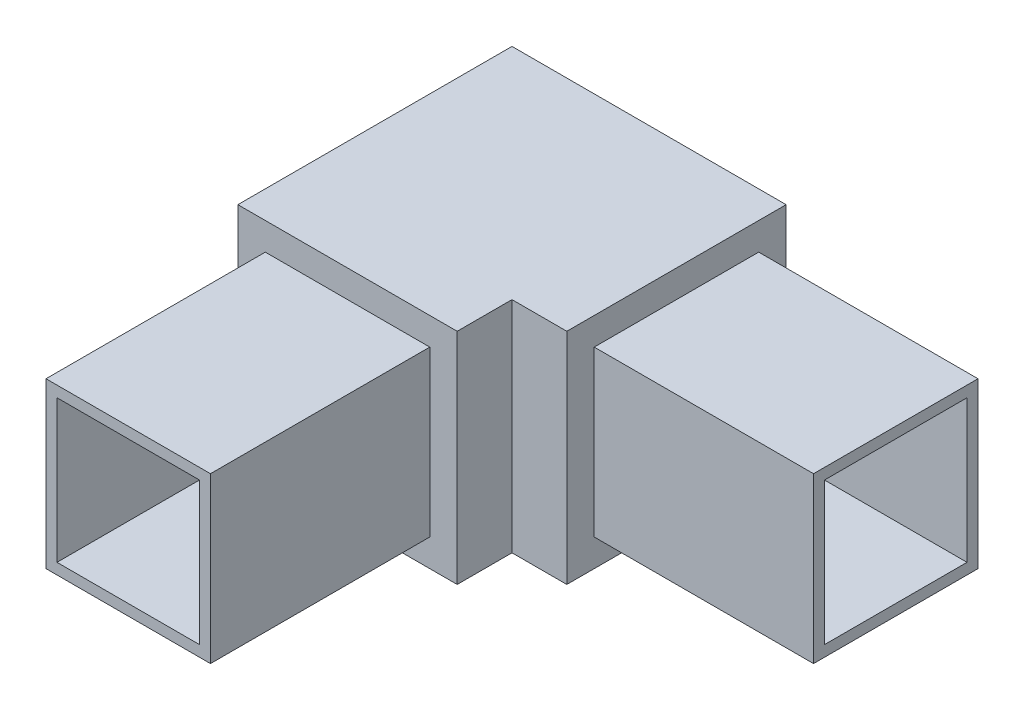
ISO-10303-21;
HEADER;
FILE_DESCRIPTION(('STEP AP214'),'2;1');
FILE_NAME('part.step','',(''),(''),'','','');
FILE_SCHEMA(('AUTOMOTIVE_DESIGN { 1 0 10303 214 1 1 1 1 }'));
ENDSEC;
DATA;
#1=APPLICATION_CONTEXT('core data for automotive mechanical design processes');
#2=APPLICATION_PROTOCOL_DEFINITION('international standard','automotive_design',2000,#1);
#3=PRODUCT_CONTEXT('',#1,'mechanical');
#4=PRODUCT('Part','Part','',(#3));
#5=PRODUCT_RELATED_PRODUCT_CATEGORY('part','',(#4));
#6=PRODUCT_DEFINITION_FORMATION('','',#4);
#7=PRODUCT_DEFINITION_CONTEXT('part definition',#1,'design');
#8=PRODUCT_DEFINITION('design','',#6,#7);
#9=PRODUCT_DEFINITION_SHAPE('','',#8);
#10=(LENGTH_UNIT() NAMED_UNIT(*) SI_UNIT(.MILLI.,.METRE.));
#11=(NAMED_UNIT(*) PLANE_ANGLE_UNIT() SI_UNIT($,.RADIAN.));
#12=(NAMED_UNIT(*) SI_UNIT($,.STERADIAN.) SOLID_ANGLE_UNIT());
#13=UNCERTAINTY_MEASURE_WITH_UNIT(LENGTH_MEASURE(1.E-05),#10,'distance_accuracy_value','');
#14=(GEOMETRIC_REPRESENTATION_CONTEXT(3) GLOBAL_UNCERTAINTY_ASSIGNED_CONTEXT((#13)) GLOBAL_UNIT_ASSIGNED_CONTEXT((#10,
#11,#12)) REPRESENTATION_CONTEXT('',''));
#15=CARTESIAN_POINT('',(0.,0.,0.));
#16=DIRECTION('',(0.,0.,1.));
#17=DIRECTION('',(1.,0.,0.));
#18=AXIS2_PLACEMENT_3D('',#15,#16,#17);
#19=CARTESIAN_POINT('',(70.,40.,-1082.0432663456));
#20=DIRECTION('',(-1.,0.,0.));
#21=DIRECTION('',(0.,0.,-1.));
#22=AXIS2_PLACEMENT_3D('',#19,#20,#21);
#23=PLANE('',#22);
#24=DIRECTION('',(0.,-1.,0.));
#25=VECTOR('',#24,1.);
#26=CARTESIAN_POINT('',(70.,35.,-1115.));
#27=LINE('',#26,#25);
#28=CARTESIAN_POINT('',(70.,35.,-1115.));
#29=VERTEX_POINT('',#28);
#30=CARTESIAN_POINT('',(70.,5.,-1115.));
#31=VERTEX_POINT('',#30);
#32=EDGE_CURVE('E380',#29,#31,#27,.T.);
#33=ORIENTED_EDGE('',*,*,#32,.F.);
#34=DIRECTION('',(0.,0.,-1.));
#35=VECTOR('',#34,1.);
#36=CARTESIAN_POINT('',(70.,35.,-1085.));
#37=LINE('',#36,#35);
#38=CARTESIAN_POINT('',(70.,35.,-1085.));
#39=VERTEX_POINT('',#38);
#40=EDGE_CURVE('E385',#39,#29,#37,.T.);
#41=ORIENTED_EDGE('',*,*,#40,.F.);
#42=DIRECTION('',(0.,1.,0.));
#43=VECTOR('',#42,1.);
#44=CARTESIAN_POINT('',(70.,5.,-1085.));
#45=LINE('',#44,#43);
#46=CARTESIAN_POINT('',(70.,5.,-1085.));
#47=VERTEX_POINT('',#46);
#48=EDGE_CURVE('E400',#47,#39,#45,.T.);
#49=ORIENTED_EDGE('',*,*,#48,.F.);
#50=DIRECTION('',(0.,0.,1.));
#51=VECTOR('',#50,1.);
#52=CARTESIAN_POINT('',(70.,5.,-1115.));
#53=LINE('',#52,#51);
#54=EDGE_CURVE('E397',#31,#47,#53,.T.);
#55=ORIENTED_EDGE('',*,*,#54,.F.);
#56=EDGE_LOOP('',(#33,#41,#49,#55));
#57=FACE_BOUND('',#56,.T.);
#58=DIRECTION('',(0.,-1.,0.));
#59=VECTOR('',#58,1.);
#60=CARTESIAN_POINT('',(70.,35.,-1113.));
#61=LINE('',#60,#59);
#62=CARTESIAN_POINT('',(70.,33.,-1113.));
#63=VERTEX_POINT('',#62);
#64=CARTESIAN_POINT('',(70.,7.,-1113.));
#65=VERTEX_POINT('',#64);
#66=EDGE_CURVE('E238',#63,#65,#61,.T.);
#67=ORIENTED_EDGE('',*,*,#66,.T.);
#68=DIRECTION('',(0.,0.,1.));
#69=VECTOR('',#68,1.);
#70=CARTESIAN_POINT('',(70.,7.,-1115.));
#71=LINE('',#70,#69);
#72=CARTESIAN_POINT('',(70.,7.,-1087.));
#73=VERTEX_POINT('',#72);
#74=EDGE_CURVE('E319',#65,#73,#71,.T.);
#75=ORIENTED_EDGE('',*,*,#74,.T.);
#76=DIRECTION('',(0.,1.,0.));
#77=VECTOR('',#76,1.);
#78=CARTESIAN_POINT('',(70.,5.,-1087.));
#79=LINE('',#78,#77);
#80=CARTESIAN_POINT('',(70.,33.,-1087.));
#81=VERTEX_POINT('',#80);
#82=EDGE_CURVE('E322',#73,#81,#79,.T.);
#83=ORIENTED_EDGE('',*,*,#82,.T.);
#84=DIRECTION('',(0.,0.,-1.));
#85=VECTOR('',#84,1.);
#86=CARTESIAN_POINT('',(70.,33.,-1085.));
#87=LINE('',#86,#85);
#88=EDGE_CURVE('E291',#81,#63,#87,.T.);
#89=ORIENTED_EDGE('',*,*,#88,.T.);
#90=EDGE_LOOP('',(#67,#75,#83,#89));
#91=FACE_BOUND('',#90,.T.);
#92=ADVANCED_FACE('F32',(#57,#91),#23,.F.);
#93=CARTESIAN_POINT('',(-103.501393306404,40.,-1082.0432663456));
#94=DIRECTION('',(0.,1.,0.));
#95=DIRECTION('',(0.,0.,-1.));
#96=AXIS2_PLACEMENT_3D('',#93,#94,#95);
#97=PLANE('',#96);
#98=DIRECTION('',(0.,0.,1.));
#99=VECTOR('',#98,1.);
#100=CARTESIAN_POINT('',(20.,40.,-1082.0432663456));
#101=LINE('',#100,#99);
#102=CARTESIAN_POINT('',(20.,40.,-1080.));
#103=VERTEX_POINT('',#102);
#104=CARTESIAN_POINT('',(20.,40.,-1070.));
#105=VERTEX_POINT('',#104);
#106=EDGE_CURVE('E433',#103,#105,#101,.T.);
#107=ORIENTED_EDGE('',*,*,#106,.F.);
#108=DIRECTION('',(1.,0.,0.));
#109=VECTOR('',#108,1.);
#110=CARTESIAN_POINT('',(-103.501393306404,40.,-1080.));
#111=LINE('',#110,#109);
#112=CARTESIAN_POINT('',(30.,40.,-1080.));
#113=VERTEX_POINT('',#112);
#114=EDGE_CURVE('E430',#103,#113,#111,.T.);
#115=ORIENTED_EDGE('',*,*,#114,.T.);
#116=DIRECTION('',(0.,0.,-1.));
#117=VECTOR('',#116,1.);
#118=CARTESIAN_POINT('',(30.,40.,-1080.));
#119=LINE('',#118,#117);
#120=CARTESIAN_POINT('',(30.,40.,-1120.));
#121=VERTEX_POINT('',#120);
#122=EDGE_CURVE('E419',#113,#121,#119,.T.);
#123=ORIENTED_EDGE('',*,*,#122,.T.);
#124=DIRECTION('',(-1.,0.,0.));
#125=VECTOR('',#124,1.);
#126=CARTESIAN_POINT('',(-103.501393306404,40.,-1120.));
#127=LINE('',#126,#125);
#128=CARTESIAN_POINT('',(-20.,40.,-1120.));
#129=VERTEX_POINT('',#128);
#130=EDGE_CURVE('E426',#121,#129,#127,.T.);
#131=ORIENTED_EDGE('',*,*,#130,.T.);
#132=DIRECTION('',(0.,0.,1.));
#133=VECTOR('',#132,1.);
#134=CARTESIAN_POINT('',(-20.,40.,-1082.0432663456));
#135=LINE('',#134,#133);
#136=CARTESIAN_POINT('',(-20.,40.,-1070.));
#137=VERTEX_POINT('',#136);
#138=EDGE_CURVE('E423',#129,#137,#135,.T.);
#139=ORIENTED_EDGE('',*,*,#138,.T.);
#140=DIRECTION('',(1.,0.,0.));
#141=VECTOR('',#140,1.);
#142=CARTESIAN_POINT('',(-20.,40.,-1070.));
#143=LINE('',#142,#141);
#144=EDGE_CURVE('E377',#137,#105,#143,.T.);
#145=ORIENTED_EDGE('',*,*,#144,.T.);
#146=EDGE_LOOP('',(#107,#115,#123,#131,#139,#145));
#147=FACE_BOUND('',#146,.T.);
#148=ADVANCED_FACE('F464',(#147),#97,.T.);
#149=CARTESIAN_POINT('',(-103.501393306404,0.,-1082.0432663456));
#150=DIRECTION('',(0.,1.,0.));
#151=DIRECTION('',(0.,0.,-1.));
#152=AXIS2_PLACEMENT_3D('',#149,#150,#151);
#153=PLANE('',#152);
#154=DIRECTION('',(-1.,0.,0.));
#155=VECTOR('',#154,1.);
#156=CARTESIAN_POINT('',(20.,0.,-1070.));
#157=LINE('',#156,#155);
#158=CARTESIAN_POINT('',(20.,0.,-1070.));
#159=VERTEX_POINT('',#158);
#160=CARTESIAN_POINT('',(-20.,0.,-1070.));
#161=VERTEX_POINT('',#160);
#162=EDGE_CURVE('E372',#159,#161,#157,.T.);
#163=ORIENTED_EDGE('',*,*,#162,.T.);
#164=DIRECTION('',(0.,0.,1.));
#165=VECTOR('',#164,1.);
#166=CARTESIAN_POINT('',(-20.,0.,-1082.0432663456));
#167=LINE('',#166,#165);
#168=CARTESIAN_POINT('',(-20.,0.,-1120.));
#169=VERTEX_POINT('',#168);
#170=EDGE_CURVE('E422',#169,#161,#167,.T.);
#171=ORIENTED_EDGE('',*,*,#170,.F.);
#172=DIRECTION('',(-1.,0.,0.));
#173=VECTOR('',#172,1.);
#174=CARTESIAN_POINT('',(-103.501393306404,0.,-1120.));
#175=LINE('',#174,#173);
#176=CARTESIAN_POINT('',(30.,0.,-1120.));
#177=VERTEX_POINT('',#176);
#178=EDGE_CURVE('E438',#177,#169,#175,.T.);
#179=ORIENTED_EDGE('',*,*,#178,.F.);
#180=DIRECTION('',(0.,0.,1.));
#181=VECTOR('',#180,1.);
#182=CARTESIAN_POINT('',(30.,0.,-1120.));
#183=LINE('',#182,#181);
#184=CARTESIAN_POINT('',(30.,0.,-1080.));
#185=VERTEX_POINT('',#184);
#186=EDGE_CURVE('E414',#177,#185,#183,.T.);
#187=ORIENTED_EDGE('',*,*,#186,.T.);
#188=DIRECTION('',(1.,0.,0.));
#189=VECTOR('',#188,1.);
#190=CARTESIAN_POINT('',(-103.501393306404,0.,-1080.));
#191=LINE('',#190,#189);
#192=CARTESIAN_POINT('',(20.,0.,-1080.));
#193=VERTEX_POINT('',#192);
#194=EDGE_CURVE('E441',#193,#185,#191,.T.);
#195=ORIENTED_EDGE('',*,*,#194,.F.);
#196=DIRECTION('',(0.,0.,1.));
#197=VECTOR('',#196,1.);
#198=CARTESIAN_POINT('',(20.,0.,-1082.0432663456));
#199=LINE('',#198,#197);
#200=EDGE_CURVE('E427',#193,#159,#199,.T.);
#201=ORIENTED_EDGE('',*,*,#200,.T.);
#202=EDGE_LOOP('',(#163,#171,#179,#187,#195,#201));
#203=FACE_BOUND('',#202,.T.);
#204=ADVANCED_FACE('F455',(#203),#153,.F.);
#205=CARTESIAN_POINT('',(-20.,40.,-1082.0432663456));
#206=DIRECTION('',(-1.,0.,0.));
#207=DIRECTION('',(0.,0.,-1.));
#208=AXIS2_PLACEMENT_3D('',#205,#206,#207);
#209=PLANE('',#208);
#210=ORIENTED_EDGE('',*,*,#138,.F.);
#211=DIRECTION('',(0.,-1.,0.));
#212=VECTOR('',#211,1.);
#213=CARTESIAN_POINT('',(-20.,40.,-1120.));
#214=LINE('',#213,#212);
#215=EDGE_CURVE('E11',#129,#169,#214,.T.);
#216=ORIENTED_EDGE('',*,*,#215,.T.);
#217=ORIENTED_EDGE('',*,*,#170,.T.);
#218=DIRECTION('',(0.,1.,0.));
#219=VECTOR('',#218,1.);
#220=CARTESIAN_POINT('',(-20.,0.,-1070.));
#221=LINE('',#220,#219);
#222=EDGE_CURVE('E375',#161,#137,#221,.T.);
#223=ORIENTED_EDGE('',*,*,#222,.T.);
#224=EDGE_LOOP('',(#210,#216,#217,#223));
#225=FACE_BOUND('',#224,.T.);
#226=ADVANCED_FACE('F34',(#225),#209,.T.);
#227=CARTESIAN_POINT('',(20.,40.,-1082.0432663456));
#228=DIRECTION('',(-1.,0.,0.));
#229=DIRECTION('',(0.,0.,-1.));
#230=AXIS2_PLACEMENT_3D('',#227,#228,#229);
#231=PLANE('',#230);
#232=DIRECTION('',(0.,-1.,0.));
#233=VECTOR('',#232,1.);
#234=CARTESIAN_POINT('',(20.,40.,-1070.));
#235=LINE('',#234,#233);
#236=EDGE_CURVE('E362',#105,#159,#235,.T.);
#237=ORIENTED_EDGE('',*,*,#236,.T.);
#238=ORIENTED_EDGE('',*,*,#200,.F.);
#239=DIRECTION('',(0.,-1.,0.));
#240=VECTOR('',#239,1.);
#241=CARTESIAN_POINT('',(20.,40.,-1080.));
#242=LINE('',#241,#240);
#243=EDGE_CURVE('E40',#103,#193,#242,.T.);
#244=ORIENTED_EDGE('',*,*,#243,.F.);
#245=ORIENTED_EDGE('',*,*,#106,.T.);
#246=EDGE_LOOP('',(#237,#238,#244,#245));
#247=FACE_BOUND('',#246,.T.);
#248=ADVANCED_FACE('F452',(#247),#231,.F.);
#249=CARTESIAN_POINT('',(-103.501393306404,40.,-1120.));
#250=DIRECTION('',(0.,0.,-1.));
#251=DIRECTION('',(1.,0.,0.));
#252=AXIS2_PLACEMENT_3D('',#249,#250,#251);
#253=PLANE('',#252);
#254=ORIENTED_EDGE('',*,*,#178,.T.);
#255=ORIENTED_EDGE('',*,*,#215,.F.);
#256=ORIENTED_EDGE('',*,*,#130,.F.);
#257=DIRECTION('',(0.,-1.,0.));
#258=VECTOR('',#257,1.);
#259=CARTESIAN_POINT('',(30.,40.,-1120.));
#260=LINE('',#259,#258);
#261=EDGE_CURVE('E407',#121,#177,#260,.T.);
#262=ORIENTED_EDGE('',*,*,#261,.T.);
#263=EDGE_LOOP('',(#254,#255,#256,#262));
#264=FACE_BOUND('',#263,.T.);
#265=ADVANCED_FACE('F471',(#264),#253,.T.);
#266=CARTESIAN_POINT('',(-103.501393306404,40.,-1080.));
#267=DIRECTION('',(0.,0.,1.));
#268=DIRECTION('',(-1.,0.,0.));
#269=AXIS2_PLACEMENT_3D('',#266,#267,#268);
#270=PLANE('',#269);
#271=ORIENTED_EDGE('',*,*,#114,.F.);
#272=ORIENTED_EDGE('',*,*,#243,.T.);
#273=ORIENTED_EDGE('',*,*,#194,.T.);
#274=DIRECTION('',(0.,1.,0.));
#275=VECTOR('',#274,1.);
#276=CARTESIAN_POINT('',(30.,0.,-1080.));
#277=LINE('',#276,#275);
#278=EDGE_CURVE('E417',#185,#113,#277,.T.);
#279=ORIENTED_EDGE('',*,*,#278,.T.);
#280=EDGE_LOOP('',(#271,#272,#273,#279));
#281=FACE_BOUND('',#280,.T.);
#282=ADVANCED_FACE('F448',(#281),#270,.T.);
#283=CARTESIAN_POINT('',(30.,0.,-1120.));
#284=DIRECTION('',(1.,0.,0.));
#285=DIRECTION('',(0.,0.,1.));
#286=AXIS2_PLACEMENT_3D('',#283,#284,#285);
#287=PLANE('',#286);
#288=DIRECTION('',(0.,0.,-1.));
#289=VECTOR('',#288,1.);
#290=CARTESIAN_POINT('',(30.,35.,-1085.));
#291=LINE('',#290,#289);
#292=CARTESIAN_POINT('',(30.,35.,-1085.));
#293=VERTEX_POINT('',#292);
#294=CARTESIAN_POINT('',(30.,35.,-1115.));
#295=VERTEX_POINT('',#294);
#296=EDGE_CURVE('E391',#293,#295,#291,.T.);
#297=ORIENTED_EDGE('',*,*,#296,.T.);
#298=DIRECTION('',(0.,-1.,0.));
#299=VECTOR('',#298,1.);
#300=CARTESIAN_POINT('',(30.,35.,-1115.));
#301=LINE('',#300,#299);
#302=CARTESIAN_POINT('',(30.,5.,-1115.));
#303=VERTEX_POINT('',#302);
#304=EDGE_CURVE('E381',#295,#303,#301,.T.);
#305=ORIENTED_EDGE('',*,*,#304,.T.);
#306=DIRECTION('',(0.,0.,1.));
#307=VECTOR('',#306,1.);
#308=CARTESIAN_POINT('',(30.,5.,-1115.));
#309=LINE('',#308,#307);
#310=CARTESIAN_POINT('',(30.,5.,-1085.));
#311=VERTEX_POINT('',#310);
#312=EDGE_CURVE('E384',#303,#311,#309,.T.);
#313=ORIENTED_EDGE('',*,*,#312,.T.);
#314=DIRECTION('',(0.,1.,0.));
#315=VECTOR('',#314,1.);
#316=CARTESIAN_POINT('',(30.,5.,-1085.));
#317=LINE('',#316,#315);
#318=EDGE_CURVE('E388',#311,#293,#317,.T.);
#319=ORIENTED_EDGE('',*,*,#318,.T.);
#320=EDGE_LOOP('',(#297,#305,#313,#319));
#321=FACE_BOUND('',#320,.T.);
#322=ORIENTED_EDGE('',*,*,#261,.F.);
#323=ORIENTED_EDGE('',*,*,#122,.F.);
#324=ORIENTED_EDGE('',*,*,#278,.F.);
#325=ORIENTED_EDGE('',*,*,#186,.F.);
#326=EDGE_LOOP('',(#322,#323,#324,#325));
#327=FACE_BOUND('',#326,.T.);
#328=ADVANCED_FACE('F460',(#321,#327),#287,.T.);
#329=CARTESIAN_POINT('',(30.,35.,-1115.));
#330=DIRECTION('',(0.,0.,-1.));
#331=DIRECTION('',(1.,0.,0.));
#332=AXIS2_PLACEMENT_3D('',#329,#330,#331);
#333=PLANE('',#332);
#334=ORIENTED_EDGE('',*,*,#32,.T.);
#335=DIRECTION('',(1.,0.,0.));
#336=VECTOR('',#335,1.);
#337=CARTESIAN_POINT('',(30.,5.,-1115.));
#338=LINE('',#337,#336);
#339=EDGE_CURVE('E394',#303,#31,#338,.T.);
#340=ORIENTED_EDGE('',*,*,#339,.F.);
#341=ORIENTED_EDGE('',*,*,#304,.F.);
#342=DIRECTION('',(1.,0.,0.));
#343=VECTOR('',#342,1.);
#344=CARTESIAN_POINT('',(30.,35.,-1115.));
#345=LINE('',#344,#343);
#346=EDGE_CURVE('E405',#295,#29,#345,.T.);
#347=ORIENTED_EDGE('',*,*,#346,.T.);
#348=EDGE_LOOP('',(#334,#340,#341,#347));
#349=FACE_BOUND('',#348,.T.);
#350=ADVANCED_FACE('F498',(#349),#333,.T.);
#351=CARTESIAN_POINT('',(30.,35.,-1085.));
#352=DIRECTION('',(0.,1.,0.));
#353=DIRECTION('',(0.,0.,-1.));
#354=AXIS2_PLACEMENT_3D('',#351,#352,#353);
#355=PLANE('',#354);
#356=ORIENTED_EDGE('',*,*,#40,.T.);
#357=ORIENTED_EDGE('',*,*,#346,.F.);
#358=ORIENTED_EDGE('',*,*,#296,.F.);
#359=DIRECTION('',(1.,0.,0.));
#360=VECTOR('',#359,1.);
#361=CARTESIAN_POINT('',(30.,35.,-1085.));
#362=LINE('',#361,#360);
#363=EDGE_CURVE('E408',#293,#39,#362,.T.);
#364=ORIENTED_EDGE('',*,*,#363,.T.);
#365=EDGE_LOOP('',(#356,#357,#358,#364));
#366=FACE_BOUND('',#365,.T.);
#367=ADVANCED_FACE('F502',(#366),#355,.T.);
#368=CARTESIAN_POINT('',(30.,5.,-1085.));
#369=DIRECTION('',(0.,0.,1.));
#370=DIRECTION('',(-1.,0.,0.));
#371=AXIS2_PLACEMENT_3D('',#368,#369,#370);
#372=PLANE('',#371);
#373=ORIENTED_EDGE('',*,*,#48,.T.);
#374=ORIENTED_EDGE('',*,*,#363,.F.);
#375=ORIENTED_EDGE('',*,*,#318,.F.);
#376=DIRECTION('',(1.,0.,0.));
#377=VECTOR('',#376,1.);
#378=CARTESIAN_POINT('',(30.,5.,-1085.));
#379=LINE('',#378,#377);
#380=EDGE_CURVE('E410',#311,#47,#379,.T.);
#381=ORIENTED_EDGE('',*,*,#380,.T.);
#382=EDGE_LOOP('',(#373,#374,#375,#381));
#383=FACE_BOUND('',#382,.T.);
#384=ADVANCED_FACE('F507',(#383),#372,.T.);
#385=CARTESIAN_POINT('',(30.,5.,-1115.));
#386=DIRECTION('',(0.,-1.,0.));
#387=DIRECTION('',(0.,0.,1.));
#388=AXIS2_PLACEMENT_3D('',#385,#386,#387);
#389=PLANE('',#388);
#390=ORIENTED_EDGE('',*,*,#54,.T.);
#391=ORIENTED_EDGE('',*,*,#380,.F.);
#392=ORIENTED_EDGE('',*,*,#312,.F.);
#393=ORIENTED_EDGE('',*,*,#339,.T.);
#394=EDGE_LOOP('',(#390,#391,#392,#393));
#395=FACE_BOUND('',#394,.T.);
#396=ADVANCED_FACE('F504',(#395),#389,.T.);
#397=CARTESIAN_POINT('',(20.,0.,-1070.));
#398=DIRECTION('',(0.,0.,1.));
#399=DIRECTION('',(-1.,0.,0.));
#400=AXIS2_PLACEMENT_3D('',#397,#398,#399);
#401=PLANE('',#400);
#402=DIRECTION('',(1.,0.,0.));
#403=VECTOR('',#402,1.);
#404=CARTESIAN_POINT('',(-15.,35.,-1070.));
#405=LINE('',#404,#403);
#406=CARTESIAN_POINT('',(-15.,35.,-1070.));
#407=VERTEX_POINT('',#406);
#408=CARTESIAN_POINT('',(15.,35.,-1070.));
#409=VERTEX_POINT('',#408);
#410=EDGE_CURVE('E348',#407,#409,#405,.T.);
#411=ORIENTED_EDGE('',*,*,#410,.T.);
#412=DIRECTION('',(0.,-1.,0.));
#413=VECTOR('',#412,1.);
#414=CARTESIAN_POINT('',(15.,35.,-1070.));
#415=LINE('',#414,#413);
#416=CARTESIAN_POINT('',(15.,5.,-1070.));
#417=VERTEX_POINT('',#416);
#418=EDGE_CURVE('E338',#409,#417,#415,.T.);
#419=ORIENTED_EDGE('',*,*,#418,.T.);
#420=DIRECTION('',(-1.,0.,0.));
#421=VECTOR('',#420,1.);
#422=CARTESIAN_POINT('',(15.,5.,-1070.));
#423=LINE('',#422,#421);
#424=CARTESIAN_POINT('',(-15.,5.,-1070.));
#425=VERTEX_POINT('',#424);
#426=EDGE_CURVE('E341',#417,#425,#423,.T.);
#427=ORIENTED_EDGE('',*,*,#426,.T.);
#428=DIRECTION('',(0.,1.,0.));
#429=VECTOR('',#428,1.);
#430=CARTESIAN_POINT('',(-15.,5.,-1070.));
#431=LINE('',#430,#429);
#432=EDGE_CURVE('E345',#425,#407,#431,.T.);
#433=ORIENTED_EDGE('',*,*,#432,.T.);
#434=EDGE_LOOP('',(#411,#419,#427,#433));
#435=FACE_BOUND('',#434,.T.);
#436=ORIENTED_EDGE('',*,*,#236,.F.);
#437=ORIENTED_EDGE('',*,*,#144,.F.);
#438=ORIENTED_EDGE('',*,*,#222,.F.);
#439=ORIENTED_EDGE('',*,*,#162,.F.);
#440=EDGE_LOOP('',(#436,#437,#438,#439));
#441=FACE_BOUND('',#440,.T.);
#442=ADVANCED_FACE('F468',(#435,#441),#401,.T.);
#443=CARTESIAN_POINT('',(15.,35.,-1070.));
#444=DIRECTION('',(1.,0.,0.));
#445=DIRECTION('',(0.,0.,1.));
#446=AXIS2_PLACEMENT_3D('',#443,#444,#445);
#447=PLANE('',#446);
#448=DIRECTION('',(0.,-1.,0.));
#449=VECTOR('',#448,1.);
#450=CARTESIAN_POINT('',(15.,35.,-1030.));
#451=LINE('',#450,#449);
#452=CARTESIAN_POINT('',(15.,35.,-1030.));
#453=VERTEX_POINT('',#452);
#454=CARTESIAN_POINT('',(15.,5.,-1030.));
#455=VERTEX_POINT('',#454);
#456=EDGE_CURVE('E266',#453,#455,#451,.T.);
#457=ORIENTED_EDGE('',*,*,#456,.T.);
#458=DIRECTION('',(0.,0.,1.));
#459=VECTOR('',#458,1.);
#460=CARTESIAN_POINT('',(15.,5.,-1070.));
#461=LINE('',#460,#459);
#462=EDGE_CURVE('E351',#417,#455,#461,.T.);
#463=ORIENTED_EDGE('',*,*,#462,.F.);
#464=ORIENTED_EDGE('',*,*,#418,.F.);
#465=DIRECTION('',(0.,0.,1.));
#466=VECTOR('',#465,1.);
#467=CARTESIAN_POINT('',(15.,35.,-1070.));
#468=LINE('',#467,#466);
#469=EDGE_CURVE('E359',#409,#453,#468,.T.);
#470=ORIENTED_EDGE('',*,*,#469,.T.);
#471=EDGE_LOOP('',(#457,#463,#464,#470));
#472=FACE_BOUND('',#471,.T.);
#473=ADVANCED_FACE('F517',(#472),#447,.T.);
#474=CARTESIAN_POINT('',(-15.,35.,-1070.));
#475=DIRECTION('',(0.,1.,0.));
#476=DIRECTION('',(0.,0.,-1.));
#477=AXIS2_PLACEMENT_3D('',#474,#475,#476);
#478=PLANE('',#477);
#479=DIRECTION('',(1.,0.,0.));
#480=VECTOR('',#479,1.);
#481=CARTESIAN_POINT('',(-15.,35.,-1030.));
#482=LINE('',#481,#480);
#483=CARTESIAN_POINT('',(-15.,35.,-1030.));
#484=VERTEX_POINT('',#483);
#485=EDGE_CURVE('E342',#484,#453,#482,.T.);
#486=ORIENTED_EDGE('',*,*,#485,.T.);
#487=ORIENTED_EDGE('',*,*,#469,.F.);
#488=ORIENTED_EDGE('',*,*,#410,.F.);
#489=DIRECTION('',(0.,0.,1.));
#490=VECTOR('',#489,1.);
#491=CARTESIAN_POINT('',(-15.,35.,-1070.));
#492=LINE('',#491,#490);
#493=EDGE_CURVE('E363',#407,#484,#492,.T.);
#494=ORIENTED_EDGE('',*,*,#493,.T.);
#495=EDGE_LOOP('',(#486,#487,#488,#494));
#496=FACE_BOUND('',#495,.T.);
#497=ADVANCED_FACE('F521',(#496),#478,.T.);
#498=CARTESIAN_POINT('',(-15.,5.,-1070.));
#499=DIRECTION('',(-1.,0.,0.));
#500=DIRECTION('',(0.,0.,-1.));
#501=AXIS2_PLACEMENT_3D('',#498,#499,#500);
#502=PLANE('',#501);
#503=DIRECTION('',(0.,1.,0.));
#504=VECTOR('',#503,1.);
#505=CARTESIAN_POINT('',(-15.,5.,-1030.));
#506=LINE('',#505,#504);
#507=CARTESIAN_POINT('',(-15.,5.,-1030.));
#508=VERTEX_POINT('',#507);
#509=EDGE_CURVE('E356',#508,#484,#506,.T.);
#510=ORIENTED_EDGE('',*,*,#509,.T.);
#511=ORIENTED_EDGE('',*,*,#493,.F.);
#512=ORIENTED_EDGE('',*,*,#432,.F.);
#513=DIRECTION('',(0.,0.,1.));
#514=VECTOR('',#513,1.);
#515=CARTESIAN_POINT('',(-15.,5.,-1070.));
#516=LINE('',#515,#514);
#517=EDGE_CURVE('E366',#425,#508,#516,.T.);
#518=ORIENTED_EDGE('',*,*,#517,.T.);
#519=EDGE_LOOP('',(#510,#511,#512,#518));
#520=FACE_BOUND('',#519,.T.);
#521=ADVANCED_FACE('F525',(#520),#502,.T.);
#522=CARTESIAN_POINT('',(15.,5.,-1070.));
#523=DIRECTION('',(0.,-1.,0.));
#524=DIRECTION('',(0.,0.,1.));
#525=AXIS2_PLACEMENT_3D('',#522,#523,#524);
#526=PLANE('',#525);
#527=DIRECTION('',(-1.,0.,0.));
#528=VECTOR('',#527,1.);
#529=CARTESIAN_POINT('',(15.,5.,-1030.));
#530=LINE('',#529,#528);
#531=EDGE_CURVE('E354',#455,#508,#530,.T.);
#532=ORIENTED_EDGE('',*,*,#531,.T.);
#533=ORIENTED_EDGE('',*,*,#517,.F.);
#534=ORIENTED_EDGE('',*,*,#426,.F.);
#535=ORIENTED_EDGE('',*,*,#462,.T.);
#536=EDGE_LOOP('',(#532,#533,#534,#535));
#537=FACE_BOUND('',#536,.T.);
#538=ADVANCED_FACE('F492',(#537),#526,.T.);
#539=CARTESIAN_POINT('',(-103.501393306404,40.,-1030.));
#540=DIRECTION('',(0.,0.,1.));
#541=DIRECTION('',(-1.,0.,0.));
#542=AXIS2_PLACEMENT_3D('',#539,#540,#541);
#543=PLANE('',#542);
#544=DIRECTION('',(1.,0.,0.));
#545=VECTOR('',#544,1.);
#546=CARTESIAN_POINT('',(-103.501393306404,33.,-1030.));
#547=LINE('',#546,#545);
#548=CARTESIAN_POINT('',(-13.,33.,-1030.));
#549=VERTEX_POINT('',#548);
#550=CARTESIAN_POINT('',(13.,33.,-1030.));
#551=VERTEX_POINT('',#550);
#552=EDGE_CURVE('E311',#549,#551,#547,.T.);
#553=ORIENTED_EDGE('',*,*,#552,.T.);
#554=DIRECTION('',(0.,-1.,0.));
#555=VECTOR('',#554,1.);
#556=CARTESIAN_POINT('',(13.,40.,-1030.));
#557=LINE('',#556,#555);
#558=CARTESIAN_POINT('',(13.,7.,-1030.));
#559=VERTEX_POINT('',#558);
#560=EDGE_CURVE('E327',#551,#559,#557,.T.);
#561=ORIENTED_EDGE('',*,*,#560,.T.);
#562=DIRECTION('',(-1.,0.,0.));
#563=VECTOR('',#562,1.);
#564=CARTESIAN_POINT('',(-103.501393306404,7.,-1030.));
#565=LINE('',#564,#563);
#566=CARTESIAN_POINT('',(-13.,7.,-1030.));
#567=VERTEX_POINT('',#566);
#568=EDGE_CURVE('E330',#559,#567,#565,.T.);
#569=ORIENTED_EDGE('',*,*,#568,.T.);
#570=DIRECTION('',(0.,1.,0.));
#571=VECTOR('',#570,1.);
#572=CARTESIAN_POINT('',(-13.,40.,-1030.));
#573=LINE('',#572,#571);
#574=EDGE_CURVE('E333',#567,#549,#573,.T.);
#575=ORIENTED_EDGE('',*,*,#574,.T.);
#576=EDGE_LOOP('',(#553,#561,#569,#575));
#577=FACE_BOUND('',#576,.T.);
#578=ORIENTED_EDGE('',*,*,#485,.F.);
#579=ORIENTED_EDGE('',*,*,#509,.F.);
#580=ORIENTED_EDGE('',*,*,#531,.F.);
#581=ORIENTED_EDGE('',*,*,#456,.F.);
#582=EDGE_LOOP('',(#578,#579,#580,#581));
#583=FACE_BOUND('',#582,.T.);
#584=ADVANCED_FACE('F489',(#577,#583),#543,.T.);
#585=CARTESIAN_POINT('',(-103.501393306404,38.,-1082.0432663456));
#586=DIRECTION('',(0.,1.,0.));
#587=DIRECTION('',(0.,0.,-1.));
#588=AXIS2_PLACEMENT_3D('',#585,#586,#587);
#589=PLANE('',#588);
#590=DIRECTION('',(0.,0.,1.));
#591=VECTOR('',#590,1.);
#592=CARTESIAN_POINT('',(18.,38.,-1082.0432663456));
#593=LINE('',#592,#591);
#594=CARTESIAN_POINT('',(18.,38.,-1082.));
#595=VERTEX_POINT('',#594);
#596=CARTESIAN_POINT('',(18.,38.,-1072.));
#597=VERTEX_POINT('',#596);
#598=EDGE_CURVE('E222',#595,#597,#593,.T.);
#599=ORIENTED_EDGE('',*,*,#598,.T.);
#600=DIRECTION('',(1.,0.,0.));
#601=VECTOR('',#600,1.);
#602=CARTESIAN_POINT('',(20.,38.,-1072.));
#603=LINE('',#602,#601);
#604=CARTESIAN_POINT('',(-18.,38.,-1072.));
#605=VERTEX_POINT('',#604);
#606=EDGE_CURVE('E232',#605,#597,#603,.T.);
#607=ORIENTED_EDGE('',*,*,#606,.F.);
#608=DIRECTION('',(0.,0.,1.));
#609=VECTOR('',#608,1.);
#610=CARTESIAN_POINT('',(-18.,38.,-1082.0432663456));
#611=LINE('',#610,#609);
#612=CARTESIAN_POINT('',(-18.,38.,-1118.));
#613=VERTEX_POINT('',#612);
#614=EDGE_CURVE('E252',#613,#605,#611,.T.);
#615=ORIENTED_EDGE('',*,*,#614,.F.);
#616=DIRECTION('',(-1.,0.,0.));
#617=VECTOR('',#616,1.);
#618=CARTESIAN_POINT('',(-103.501393306404,38.,-1118.));
#619=LINE('',#618,#617);
#620=CARTESIAN_POINT('',(28.,38.,-1118.));
#621=VERTEX_POINT('',#620);
#622=EDGE_CURVE('E249',#621,#613,#619,.T.);
#623=ORIENTED_EDGE('',*,*,#622,.F.);
#624=DIRECTION('',(0.,0.,-1.));
#625=VECTOR('',#624,1.);
#626=CARTESIAN_POINT('',(28.,38.,-1120.));
#627=LINE('',#626,#625);
#628=CARTESIAN_POINT('',(28.,38.,-1082.));
#629=VERTEX_POINT('',#628);
#630=EDGE_CURVE('E256',#629,#621,#627,.T.);
#631=ORIENTED_EDGE('',*,*,#630,.F.);
#632=DIRECTION('',(1.,0.,0.));
#633=VECTOR('',#632,1.);
#634=CARTESIAN_POINT('',(-103.501393306404,38.,-1082.));
#635=LINE('',#634,#633);
#636=EDGE_CURVE('E244',#595,#629,#635,.T.);
#637=ORIENTED_EDGE('',*,*,#636,.F.);
#638=EDGE_LOOP('',(#599,#607,#615,#623,#631,#637));
#639=FACE_BOUND('',#638,.T.);
#640=ADVANCED_FACE('F241',(#639),#589,.F.);
#641=CARTESIAN_POINT('',(-103.501393306404,2.,-1082.0432663456));
#642=DIRECTION('',(0.,1.,0.));
#643=DIRECTION('',(0.,0.,-1.));
#644=AXIS2_PLACEMENT_3D('',#641,#642,#643);
#645=PLANE('',#644);
#646=DIRECTION('',(-1.,0.,0.));
#647=VECTOR('',#646,1.);
#648=CARTESIAN_POINT('',(-103.501393306404,2.,-1072.));
#649=LINE('',#648,#647);
#650=CARTESIAN_POINT('',(18.,2.,-1072.));
#651=VERTEX_POINT('',#650);
#652=CARTESIAN_POINT('',(-18.,2.,-1072.));
#653=VERTEX_POINT('',#652);
#654=EDGE_CURVE('E228',#651,#653,#649,.T.);
#655=ORIENTED_EDGE('',*,*,#654,.F.);
#656=DIRECTION('',(0.,0.,1.));
#657=VECTOR('',#656,1.);
#658=CARTESIAN_POINT('',(18.,2.,-1082.0432663456));
#659=LINE('',#658,#657);
#660=CARTESIAN_POINT('',(18.,2.,-1082.));
#661=VERTEX_POINT('',#660);
#662=EDGE_CURVE('E224',#661,#651,#659,.T.);
#663=ORIENTED_EDGE('',*,*,#662,.F.);
#664=DIRECTION('',(1.,0.,0.));
#665=VECTOR('',#664,1.);
#666=CARTESIAN_POINT('',(-103.501393306404,2.,-1082.));
#667=LINE('',#666,#665);
#668=CARTESIAN_POINT('',(28.,2.,-1082.));
#669=VERTEX_POINT('',#668);
#670=EDGE_CURVE('E269',#661,#669,#667,.T.);
#671=ORIENTED_EDGE('',*,*,#670,.T.);
#672=DIRECTION('',(0.,0.,1.));
#673=VECTOR('',#672,1.);
#674=CARTESIAN_POINT('',(28.,2.,-1082.0432663456));
#675=LINE('',#674,#673);
#676=CARTESIAN_POINT('',(28.,2.,-1118.));
#677=VERTEX_POINT('',#676);
#678=EDGE_CURVE('E272',#677,#669,#675,.T.);
#679=ORIENTED_EDGE('',*,*,#678,.F.);
#680=DIRECTION('',(-1.,0.,0.));
#681=VECTOR('',#680,1.);
#682=CARTESIAN_POINT('',(-103.501393306404,2.,-1118.));
#683=LINE('',#682,#681);
#684=CARTESIAN_POINT('',(-18.,2.,-1118.));
#685=VERTEX_POINT('',#684);
#686=EDGE_CURVE('E264',#677,#685,#683,.T.);
#687=ORIENTED_EDGE('',*,*,#686,.T.);
#688=DIRECTION('',(0.,0.,1.));
#689=VECTOR('',#688,1.);
#690=CARTESIAN_POINT('',(-18.,2.,-1082.0432663456));
#691=LINE('',#690,#689);
#692=EDGE_CURVE('E258',#685,#653,#691,.T.);
#693=ORIENTED_EDGE('',*,*,#692,.T.);
#694=EDGE_LOOP('',(#655,#663,#671,#679,#687,#693));
#695=FACE_BOUND('',#694,.T.);
#696=ADVANCED_FACE('F583',(#695),#645,.T.);
#697=CARTESIAN_POINT('',(-18.,40.,-1082.0432663456));
#698=DIRECTION('',(-1.,0.,0.));
#699=DIRECTION('',(0.,0.,-1.));
#700=AXIS2_PLACEMENT_3D('',#697,#698,#699);
#701=PLANE('',#700);
#702=ORIENTED_EDGE('',*,*,#614,.T.);
#703=DIRECTION('',(0.,1.,0.));
#704=VECTOR('',#703,1.);
#705=CARTESIAN_POINT('',(-18.,0.,-1072.));
#706=LINE('',#705,#704);
#707=EDGE_CURVE('E234',#653,#605,#706,.T.);
#708=ORIENTED_EDGE('',*,*,#707,.F.);
#709=ORIENTED_EDGE('',*,*,#692,.F.);
#710=DIRECTION('',(0.,-1.,0.));
#711=VECTOR('',#710,1.);
#712=CARTESIAN_POINT('',(-18.,40.,-1118.));
#713=LINE('',#712,#711);
#714=EDGE_CURVE('E247',#613,#685,#713,.T.);
#715=ORIENTED_EDGE('',*,*,#714,.F.);
#716=EDGE_LOOP('',(#702,#708,#709,#715));
#717=FACE_BOUND('',#716,.T.);
#718=ADVANCED_FACE('F580',(#717),#701,.F.);
#719=CARTESIAN_POINT('',(18.,40.,-1082.0432663456));
#720=DIRECTION('',(-1.,0.,0.));
#721=DIRECTION('',(0.,0.,-1.));
#722=AXIS2_PLACEMENT_3D('',#719,#720,#721);
#723=PLANE('',#722);
#724=DIRECTION('',(0.,-1.,0.));
#725=VECTOR('',#724,1.);
#726=CARTESIAN_POINT('',(18.,40.,-1072.));
#727=LINE('',#726,#725);
#728=EDGE_CURVE('E218',#597,#651,#727,.T.);
#729=ORIENTED_EDGE('',*,*,#728,.F.);
#730=ORIENTED_EDGE('',*,*,#598,.F.);
#731=DIRECTION('',(0.,-1.,0.));
#732=VECTOR('',#731,1.);
#733=CARTESIAN_POINT('',(18.,40.,-1082.));
#734=LINE('',#733,#732);
#735=EDGE_CURVE('E245',#595,#661,#734,.T.);
#736=ORIENTED_EDGE('',*,*,#735,.T.);
#737=ORIENTED_EDGE('',*,*,#662,.T.);
#738=EDGE_LOOP('',(#729,#730,#736,#737));
#739=FACE_BOUND('',#738,.T.);
#740=ADVANCED_FACE('F220',(#739),#723,.T.);
#741=CARTESIAN_POINT('',(-103.501393306404,40.,-1118.));
#742=DIRECTION('',(0.,0.,-1.));
#743=DIRECTION('',(1.,0.,0.));
#744=AXIS2_PLACEMENT_3D('',#741,#742,#743);
#745=PLANE('',#744);
#746=ORIENTED_EDGE('',*,*,#686,.F.);
#747=DIRECTION('',(0.,-1.,0.));
#748=VECTOR('',#747,1.);
#749=CARTESIAN_POINT('',(28.,0.,-1118.));
#750=LINE('',#749,#748);
#751=EDGE_CURVE('E275',#621,#677,#750,.T.);
#752=ORIENTED_EDGE('',*,*,#751,.F.);
#753=ORIENTED_EDGE('',*,*,#622,.T.);
#754=ORIENTED_EDGE('',*,*,#714,.T.);
#755=EDGE_LOOP('',(#746,#752,#753,#754));
#756=FACE_BOUND('',#755,.T.);
#757=ADVANCED_FACE('F573',(#756),#745,.F.);
#758=CARTESIAN_POINT('',(-103.501393306404,40.,-1082.));
#759=DIRECTION('',(0.,0.,1.));
#760=DIRECTION('',(-1.,0.,0.));
#761=AXIS2_PLACEMENT_3D('',#758,#759,#760);
#762=PLANE('',#761);
#763=ORIENTED_EDGE('',*,*,#636,.T.);
#764=DIRECTION('',(0.,1.,0.));
#765=VECTOR('',#764,1.);
#766=CARTESIAN_POINT('',(28.,0.,-1082.));
#767=LINE('',#766,#765);
#768=EDGE_CURVE('E259',#669,#629,#767,.T.);
#769=ORIENTED_EDGE('',*,*,#768,.F.);
#770=ORIENTED_EDGE('',*,*,#670,.F.);
#771=ORIENTED_EDGE('',*,*,#735,.F.);
#772=EDGE_LOOP('',(#763,#769,#770,#771));
#773=FACE_BOUND('',#772,.T.);
#774=ADVANCED_FACE('F569',(#773),#762,.F.);
#775=CARTESIAN_POINT('',(28.,0.,-1120.));
#776=DIRECTION('',(1.,0.,0.));
#777=DIRECTION('',(0.,0.,1.));
#778=AXIS2_PLACEMENT_3D('',#775,#776,#777);
#779=PLANE('',#778);
#780=DIRECTION('',(0.,0.,-1.));
#781=VECTOR('',#780,1.);
#782=CARTESIAN_POINT('',(28.,33.,-1120.));
#783=LINE('',#782,#781);
#784=CARTESIAN_POINT('',(28.,33.,-1087.));
#785=VERTEX_POINT('',#784);
#786=CARTESIAN_POINT('',(28.,33.,-1113.));
#787=VERTEX_POINT('',#786);
#788=EDGE_CURVE('E279',#785,#787,#783,.T.);
#789=ORIENTED_EDGE('',*,*,#788,.F.);
#790=DIRECTION('',(0.,1.,0.));
#791=VECTOR('',#790,1.);
#792=CARTESIAN_POINT('',(28.,0.,-1087.));
#793=LINE('',#792,#791);
#794=CARTESIAN_POINT('',(28.,7.,-1087.));
#795=VERTEX_POINT('',#794);
#796=EDGE_CURVE('E283',#795,#785,#793,.T.);
#797=ORIENTED_EDGE('',*,*,#796,.F.);
#798=DIRECTION('',(0.,0.,1.));
#799=VECTOR('',#798,1.);
#800=CARTESIAN_POINT('',(28.,7.,-1120.));
#801=LINE('',#800,#799);
#802=CARTESIAN_POINT('',(28.,7.,-1113.));
#803=VERTEX_POINT('',#802);
#804=EDGE_CURVE('E285',#803,#795,#801,.T.);
#805=ORIENTED_EDGE('',*,*,#804,.F.);
#806=DIRECTION('',(0.,-1.,0.));
#807=VECTOR('',#806,1.);
#808=CARTESIAN_POINT('',(28.,0.,-1113.));
#809=LINE('',#808,#807);
#810=EDGE_CURVE('E288',#787,#803,#809,.T.);
#811=ORIENTED_EDGE('',*,*,#810,.F.);
#812=EDGE_LOOP('',(#789,#797,#805,#811));
#813=FACE_BOUND('',#812,.T.);
#814=ORIENTED_EDGE('',*,*,#751,.T.);
#815=ORIENTED_EDGE('',*,*,#678,.T.);
#816=ORIENTED_EDGE('',*,*,#768,.T.);
#817=ORIENTED_EDGE('',*,*,#630,.T.);
#818=EDGE_LOOP('',(#814,#815,#816,#817));
#819=FACE_BOUND('',#818,.T.);
#820=ADVANCED_FACE('F565',(#813,#819),#779,.F.);
#821=CARTESIAN_POINT('',(30.,35.,-1113.));
#822=DIRECTION('',(0.,0.,-1.));
#823=DIRECTION('',(1.,0.,0.));
#824=AXIS2_PLACEMENT_3D('',#821,#822,#823);
#825=PLANE('',#824);
#826=ORIENTED_EDGE('',*,*,#66,.F.);
#827=DIRECTION('',(1.,0.,0.));
#828=VECTOR('',#827,1.);
#829=CARTESIAN_POINT('',(30.,33.,-1113.));
#830=LINE('',#829,#828);
#831=EDGE_CURVE('E293',#787,#63,#830,.T.);
#832=ORIENTED_EDGE('',*,*,#831,.F.);
#833=ORIENTED_EDGE('',*,*,#810,.T.);
#834=DIRECTION('',(1.,0.,0.));
#835=VECTOR('',#834,1.);
#836=CARTESIAN_POINT('',(30.,7.,-1113.));
#837=LINE('',#836,#835);
#838=EDGE_CURVE('E282',#803,#65,#837,.T.);
#839=ORIENTED_EDGE('',*,*,#838,.T.);
#840=EDGE_LOOP('',(#826,#832,#833,#839));
#841=FACE_BOUND('',#840,.T.);
#842=ADVANCED_FACE('F561',(#841),#825,.F.);
#843=CARTESIAN_POINT('',(30.,33.,-1085.));
#844=DIRECTION('',(0.,1.,0.));
#845=DIRECTION('',(0.,0.,-1.));
#846=AXIS2_PLACEMENT_3D('',#843,#844,#845);
#847=PLANE('',#846);
#848=ORIENTED_EDGE('',*,*,#88,.F.);
#849=DIRECTION('',(1.,0.,0.));
#850=VECTOR('',#849,1.);
#851=CARTESIAN_POINT('',(30.,33.,-1087.));
#852=LINE('',#851,#850);
#853=EDGE_CURVE('E47',#785,#81,#852,.T.);
#854=ORIENTED_EDGE('',*,*,#853,.F.);
#855=ORIENTED_EDGE('',*,*,#788,.T.);
#856=ORIENTED_EDGE('',*,*,#831,.T.);
#857=EDGE_LOOP('',(#848,#854,#855,#856));
#858=FACE_BOUND('',#857,.T.);
#859=ADVANCED_FACE('F558',(#858),#847,.F.);
#860=CARTESIAN_POINT('',(30.,5.,-1087.));
#861=DIRECTION('',(0.,0.,1.));
#862=DIRECTION('',(-1.,0.,0.));
#863=AXIS2_PLACEMENT_3D('',#860,#861,#862);
#864=PLANE('',#863);
#865=ORIENTED_EDGE('',*,*,#82,.F.);
#866=DIRECTION('',(1.,0.,0.));
#867=VECTOR('',#866,1.);
#868=CARTESIAN_POINT('',(30.,7.,-1087.));
#869=LINE('',#868,#867);
#870=EDGE_CURVE('E296',#795,#73,#869,.T.);
#871=ORIENTED_EDGE('',*,*,#870,.F.);
#872=ORIENTED_EDGE('',*,*,#796,.T.);
#873=ORIENTED_EDGE('',*,*,#853,.T.);
#874=EDGE_LOOP('',(#865,#871,#872,#873));
#875=FACE_BOUND('',#874,.T.);
#876=ADVANCED_FACE('F554',(#875),#864,.F.);
#877=CARTESIAN_POINT('',(30.,7.,-1115.));
#878=DIRECTION('',(0.,-1.,0.));
#879=DIRECTION('',(0.,0.,1.));
#880=AXIS2_PLACEMENT_3D('',#877,#878,#879);
#881=PLANE('',#880);
#882=ORIENTED_EDGE('',*,*,#74,.F.);
#883=ORIENTED_EDGE('',*,*,#838,.F.);
#884=ORIENTED_EDGE('',*,*,#804,.T.);
#885=ORIENTED_EDGE('',*,*,#870,.T.);
#886=EDGE_LOOP('',(#882,#883,#884,#885));
#887=FACE_BOUND('',#886,.T.);
#888=ADVANCED_FACE('F550',(#887),#881,.F.);
#889=CARTESIAN_POINT('',(20.,0.,-1072.));
#890=DIRECTION('',(0.,0.,1.));
#891=DIRECTION('',(-1.,0.,0.));
#892=AXIS2_PLACEMENT_3D('',#889,#890,#891);
#893=PLANE('',#892);
#894=DIRECTION('',(1.,0.,0.));
#895=VECTOR('',#894,1.);
#896=CARTESIAN_POINT('',(20.,33.,-1072.));
#897=LINE('',#896,#895);
#898=CARTESIAN_POINT('',(-13.,33.,-1072.));
#899=VERTEX_POINT('',#898);
#900=CARTESIAN_POINT('',(13.,33.,-1072.));
#901=VERTEX_POINT('',#900);
#902=EDGE_CURVE('E299',#899,#901,#897,.T.);
#903=ORIENTED_EDGE('',*,*,#902,.F.);
#904=DIRECTION('',(0.,1.,0.));
#905=VECTOR('',#904,1.);
#906=CARTESIAN_POINT('',(-13.,0.,-1072.));
#907=LINE('',#906,#905);
#908=CARTESIAN_POINT('',(-13.,7.,-1072.));
#909=VERTEX_POINT('',#908);
#910=EDGE_CURVE('E303',#909,#899,#907,.T.);
#911=ORIENTED_EDGE('',*,*,#910,.F.);
#912=DIRECTION('',(-1.,0.,0.));
#913=VECTOR('',#912,1.);
#914=CARTESIAN_POINT('',(20.,7.,-1072.));
#915=LINE('',#914,#913);
#916=CARTESIAN_POINT('',(13.,7.,-1072.));
#917=VERTEX_POINT('',#916);
#918=EDGE_CURVE('E306',#917,#909,#915,.T.);
#919=ORIENTED_EDGE('',*,*,#918,.F.);
#920=DIRECTION('',(0.,-1.,0.));
#921=VECTOR('',#920,1.);
#922=CARTESIAN_POINT('',(13.,0.,-1072.));
#923=LINE('',#922,#921);
#924=EDGE_CURVE('E308',#901,#917,#923,.T.);
#925=ORIENTED_EDGE('',*,*,#924,.F.);
#926=EDGE_LOOP('',(#903,#911,#919,#925));
#927=FACE_BOUND('',#926,.T.);
#928=ORIENTED_EDGE('',*,*,#728,.T.);
#929=ORIENTED_EDGE('',*,*,#654,.T.);
#930=ORIENTED_EDGE('',*,*,#707,.T.);
#931=ORIENTED_EDGE('',*,*,#606,.T.);
#932=EDGE_LOOP('',(#928,#929,#930,#931));
#933=FACE_BOUND('',#932,.T.);
#934=ADVANCED_FACE('F233',(#927,#933),#893,.F.);
#935=CARTESIAN_POINT('',(13.,35.,-1070.));
#936=DIRECTION('',(1.,0.,0.));
#937=DIRECTION('',(0.,0.,1.));
#938=AXIS2_PLACEMENT_3D('',#935,#936,#937);
#939=PLANE('',#938);
#940=ORIENTED_EDGE('',*,*,#560,.F.);
#941=DIRECTION('',(0.,0.,1.));
#942=VECTOR('',#941,1.);
#943=CARTESIAN_POINT('',(13.,33.,-1070.));
#944=LINE('',#943,#942);
#945=EDGE_CURVE('E229',#901,#551,#944,.T.);
#946=ORIENTED_EDGE('',*,*,#945,.F.);
#947=ORIENTED_EDGE('',*,*,#924,.T.);
#948=DIRECTION('',(0.,0.,1.));
#949=VECTOR('',#948,1.);
#950=CARTESIAN_POINT('',(13.,7.,-1070.));
#951=LINE('',#950,#949);
#952=EDGE_CURVE('E302',#917,#559,#951,.T.);
#953=ORIENTED_EDGE('',*,*,#952,.T.);
#954=EDGE_LOOP('',(#940,#946,#947,#953));
#955=FACE_BOUND('',#954,.T.);
#956=ADVANCED_FACE('F543',(#955),#939,.F.);
#957=CARTESIAN_POINT('',(-15.,33.,-1070.));
#958=DIRECTION('',(0.,1.,0.));
#959=DIRECTION('',(0.,0.,-1.));
#960=AXIS2_PLACEMENT_3D('',#957,#958,#959);
#961=PLANE('',#960);
#962=ORIENTED_EDGE('',*,*,#552,.F.);
#963=DIRECTION('',(0.,0.,1.));
#964=VECTOR('',#963,1.);
#965=CARTESIAN_POINT('',(-13.,33.,-1070.));
#966=LINE('',#965,#964);
#967=EDGE_CURVE('E313',#899,#549,#966,.T.);
#968=ORIENTED_EDGE('',*,*,#967,.F.);
#969=ORIENTED_EDGE('',*,*,#902,.T.);
#970=ORIENTED_EDGE('',*,*,#945,.T.);
#971=EDGE_LOOP('',(#962,#968,#969,#970));
#972=FACE_BOUND('',#971,.T.);
#973=ADVANCED_FACE('F539',(#972),#961,.F.);
#974=CARTESIAN_POINT('',(-13.,5.,-1070.));
#975=DIRECTION('',(-1.,0.,0.));
#976=DIRECTION('',(0.,0.,-1.));
#977=AXIS2_PLACEMENT_3D('',#974,#975,#976);
#978=PLANE('',#977);
#979=ORIENTED_EDGE('',*,*,#574,.F.);
#980=DIRECTION('',(0.,0.,1.));
#981=VECTOR('',#980,1.);
#982=CARTESIAN_POINT('',(-13.,7.,-1070.));
#983=LINE('',#982,#981);
#984=EDGE_CURVE('E55',#909,#567,#983,.T.);
#985=ORIENTED_EDGE('',*,*,#984,.F.);
#986=ORIENTED_EDGE('',*,*,#910,.T.);
#987=ORIENTED_EDGE('',*,*,#967,.T.);
#988=EDGE_LOOP('',(#979,#985,#986,#987));
#989=FACE_BOUND('',#988,.T.);
#990=ADVANCED_FACE('F536',(#989),#978,.F.);
#991=CARTESIAN_POINT('',(15.,7.,-1070.));
#992=DIRECTION('',(0.,-1.,0.));
#993=DIRECTION('',(0.,0.,1.));
#994=AXIS2_PLACEMENT_3D('',#991,#992,#993);
#995=PLANE('',#994);
#996=ORIENTED_EDGE('',*,*,#568,.F.);
#997=ORIENTED_EDGE('',*,*,#952,.F.);
#998=ORIENTED_EDGE('',*,*,#918,.T.);
#999=ORIENTED_EDGE('',*,*,#984,.T.);
#1000=EDGE_LOOP('',(#996,#997,#998,#999));
#1001=FACE_BOUND('',#1000,.T.);
#1002=ADVANCED_FACE('F533',(#1001),#995,.F.);
#1003=CLOSED_SHELL('',(#92,#148,#204,#226,#248,#265,#282,#328,#350,#367,#384,#396,#442,#473,
#497,#521,#538,#584,#640,#696,#718,#740,#757,#774,#820,#842,#859,#876,#888,#934,#956,#973,#990,#1002));
#1004=MANIFOLD_SOLID_BREP('B2',#1003);
#1005=ADVANCED_BREP_SHAPE_REPRESENTATION('',(#18,#1004),#14);
#1006=SHAPE_DEFINITION_REPRESENTATION(#9,#1005);
ENDSEC;
END-ISO-10303-21;
